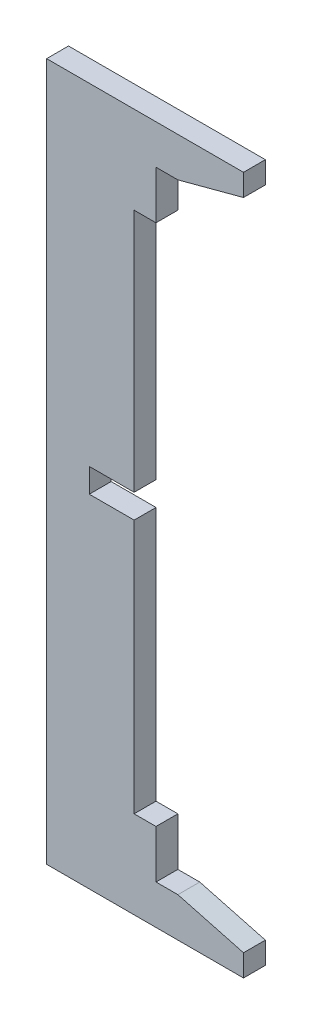
ISO-10303-21;
HEADER;
FILE_DESCRIPTION(('STEP AP214'),'2;1');
FILE_NAME('part.step','',(''),(''),'','','');
FILE_SCHEMA(('AUTOMOTIVE_DESIGN { 1 0 10303 214 1 1 1 1 }'));
ENDSEC;
DATA;
#1=APPLICATION_CONTEXT('core data for automotive mechanical design processes');
#2=APPLICATION_PROTOCOL_DEFINITION('international standard','automotive_design',2000,#1);
#3=PRODUCT_CONTEXT('',#1,'mechanical');
#4=PRODUCT('Part','Part','',(#3));
#5=PRODUCT_RELATED_PRODUCT_CATEGORY('part','',(#4));
#6=PRODUCT_DEFINITION_FORMATION('','',#4);
#7=PRODUCT_DEFINITION_CONTEXT('part definition',#1,'design');
#8=PRODUCT_DEFINITION('design','',#6,#7);
#9=PRODUCT_DEFINITION_SHAPE('','',#8);
#10=(LENGTH_UNIT() NAMED_UNIT(*) SI_UNIT(.MILLI.,.METRE.));
#11=(NAMED_UNIT(*) PLANE_ANGLE_UNIT() SI_UNIT($,.RADIAN.));
#12=(NAMED_UNIT(*) SI_UNIT($,.STERADIAN.) SOLID_ANGLE_UNIT());
#13=UNCERTAINTY_MEASURE_WITH_UNIT(LENGTH_MEASURE(1.E-05),#10,'distance_accuracy_value','');
#14=(GEOMETRIC_REPRESENTATION_CONTEXT(3) GLOBAL_UNCERTAINTY_ASSIGNED_CONTEXT((#13)) GLOBAL_UNIT_ASSIGNED_CONTEXT((#10,
#11,#12)) REPRESENTATION_CONTEXT('',''));
#15=CARTESIAN_POINT('',(0.,0.,0.));
#16=DIRECTION('',(0.,0.,1.));
#17=DIRECTION('',(1.,0.,0.));
#18=AXIS2_PLACEMENT_3D('',#15,#16,#17);
#19=CARTESIAN_POINT('',(-366.252975542008,-70.0794818591962,2.5));
#20=DIRECTION('',(-1.,0.,0.));
#21=DIRECTION('',(0.,0.,1.));
#22=AXIS2_PLACEMENT_3D('',#19,#20,#21);
#23=PLANE('',#22);
#24=DIRECTION('',(0.,1.,0.));
#25=VECTOR('',#24,1.);
#26=CARTESIAN_POINT('',(-366.252975542008,-70.0794818591962,-2.5));
#27=LINE('',#26,#25);
#28=CARTESIAN_POINT('',(-366.252975542008,-70.0794818591962,-2.5));
#29=VERTEX_POINT('',#28);
#30=CARTESIAN_POINT('',(-366.252975542008,-14.229117514226,-2.5));
#31=VERTEX_POINT('',#30);
#32=EDGE_CURVE('E188',#29,#31,#27,.T.);
#33=ORIENTED_EDGE('',*,*,#32,.T.);
#34=DIRECTION('',(0.,0.,-1.));
#35=VECTOR('',#34,1.);
#36=CARTESIAN_POINT('',(-366.252975542008,-14.229117514226,2.5));
#37=LINE('',#36,#35);
#38=CARTESIAN_POINT('',(-366.252975542008,-14.229117514226,2.5));
#39=VERTEX_POINT('',#38);
#40=EDGE_CURVE('E11',#39,#31,#37,.T.);
#41=ORIENTED_EDGE('',*,*,#40,.F.);
#42=DIRECTION('',(0.,1.,0.));
#43=VECTOR('',#42,1.);
#44=CARTESIAN_POINT('',(-366.252975542008,-70.0794818591962,2.5));
#45=LINE('',#44,#43);
#46=CARTESIAN_POINT('',(-366.252975542008,-70.0794818591962,2.5));
#47=VERTEX_POINT('',#46);
#48=EDGE_CURVE('E222',#47,#39,#45,.T.);
#49=ORIENTED_EDGE('',*,*,#48,.F.);
#50=DIRECTION('',(0.,0.,-1.));
#51=VECTOR('',#50,1.);
#52=CARTESIAN_POINT('',(-366.252975542008,-70.0794818591962,2.5));
#53=LINE('',#52,#51);
#54=EDGE_CURVE('E184',#47,#29,#53,.T.);
#55=ORIENTED_EDGE('',*,*,#54,.T.);
#56=EDGE_LOOP('',(#33,#41,#49,#55));
#57=FACE_BOUND('',#56,.T.);
#58=ADVANCED_FACE('F32',(#57),#23,.F.);
#59=CARTESIAN_POINT('',(-366.252975542008,-14.229117514226,2.5));
#60=DIRECTION('',(0.,1.,0.));
#61=DIRECTION('',(0.,0.,1.));
#62=AXIS2_PLACEMENT_3D('',#59,#60,#61);
#63=PLANE('',#62);
#64=DIRECTION('',(1.,0.,0.));
#65=VECTOR('',#64,1.);
#66=CARTESIAN_POINT('',(-366.252975542008,-14.229117514226,-2.5));
#67=LINE('',#66,#65);
#68=CARTESIAN_POINT('',(-361.252975542008,-14.229117514226,-2.5));
#69=VERTEX_POINT('',#68);
#70=EDGE_CURVE('E191',#31,#69,#67,.T.);
#71=ORIENTED_EDGE('',*,*,#70,.T.);
#72=DIRECTION('',(0.,0.,-1.));
#73=VECTOR('',#72,1.);
#74=CARTESIAN_POINT('',(-361.252975542008,-14.229117514226,2.5));
#75=LINE('',#74,#73);
#76=CARTESIAN_POINT('',(-361.252975542008,-14.229117514226,2.5));
#77=VERTEX_POINT('',#76);
#78=EDGE_CURVE('E40',#77,#69,#75,.T.);
#79=ORIENTED_EDGE('',*,*,#78,.F.);
#80=DIRECTION('',(1.,0.,0.));
#81=VECTOR('',#80,1.);
#82=CARTESIAN_POINT('',(-366.252975542008,-14.229117514226,2.5));
#83=LINE('',#82,#81);
#84=EDGE_CURVE('E121',#39,#77,#83,.T.);
#85=ORIENTED_EDGE('',*,*,#84,.F.);
#86=ORIENTED_EDGE('',*,*,#40,.T.);
#87=EDGE_LOOP('',(#71,#79,#85,#86));
#88=FACE_BOUND('',#87,.T.);
#89=ADVANCED_FACE('F330',(#88),#63,.F.);
#90=CARTESIAN_POINT('',(-361.252975542008,-14.229117514226,2.5));
#91=DIRECTION('',(-1.,0.,0.));
#92=DIRECTION('',(0.,0.,1.));
#93=AXIS2_PLACEMENT_3D('',#90,#91,#92);
#94=PLANE('',#93);
#95=DIRECTION('',(0.,1.,0.));
#96=VECTOR('',#95,1.);
#97=CARTESIAN_POINT('',(-361.252975542008,-14.229117514226,-2.5));
#98=LINE('',#97,#96);
#99=CARTESIAN_POINT('',(-361.252975542008,-3.22911751422602,-2.5));
#100=VERTEX_POINT('',#99);
#101=EDGE_CURVE('E193',#69,#100,#98,.T.);
#102=ORIENTED_EDGE('',*,*,#101,.T.);
#103=DIRECTION('',(0.,0.,-1.));
#104=VECTOR('',#103,1.);
#105=CARTESIAN_POINT('',(-361.252975542008,-3.22911751422602,2.5));
#106=LINE('',#105,#104);
#107=CARTESIAN_POINT('',(-361.252975542008,-3.22911751422602,2.5));
#108=VERTEX_POINT('',#107);
#109=EDGE_CURVE('E259',#108,#100,#106,.T.);
#110=ORIENTED_EDGE('',*,*,#109,.F.);
#111=DIRECTION('',(0.,1.,0.));
#112=VECTOR('',#111,1.);
#113=CARTESIAN_POINT('',(-361.252975542008,-14.229117514226,2.5));
#114=LINE('',#113,#112);
#115=EDGE_CURVE('E267',#77,#108,#114,.T.);
#116=ORIENTED_EDGE('',*,*,#115,.F.);
#117=ORIENTED_EDGE('',*,*,#78,.T.);
#118=EDGE_LOOP('',(#102,#110,#116,#117));
#119=FACE_BOUND('',#118,.T.);
#120=ADVANCED_FACE('F265',(#119),#94,.F.);
#121=CARTESIAN_POINT('',(-361.252975542008,-3.22911751422602,2.5));
#122=DIRECTION('',(0.,1.,0.));
#123=DIRECTION('',(0.,0.,1.));
#124=AXIS2_PLACEMENT_3D('',#121,#122,#123);
#125=PLANE('',#124);
#126=DIRECTION('',(1.,0.,0.));
#127=VECTOR('',#126,1.);
#128=CARTESIAN_POINT('',(-361.252975542008,-3.22911751422602,-2.5));
#129=LINE('',#128,#127);
#130=CARTESIAN_POINT('',(-356.252975542007,-3.22911751422602,-2.5));
#131=VERTEX_POINT('',#130);
#132=EDGE_CURVE('E195',#100,#131,#129,.T.);
#133=ORIENTED_EDGE('',*,*,#132,.T.);
#134=DIRECTION('',(0.,0.,-1.));
#135=VECTOR('',#134,1.);
#136=CARTESIAN_POINT('',(-356.252975542007,-3.22911751422602,2.5));
#137=LINE('',#136,#135);
#138=CARTESIAN_POINT('',(-356.252975542007,-3.22911751422602,2.5));
#139=VERTEX_POINT('',#138);
#140=EDGE_CURVE('E256',#139,#131,#137,.T.);
#141=ORIENTED_EDGE('',*,*,#140,.F.);
#142=DIRECTION('',(1.,0.,0.));
#143=VECTOR('',#142,1.);
#144=CARTESIAN_POINT('',(-361.252975542008,-3.22911751422602,2.5));
#145=LINE('',#144,#143);
#146=EDGE_CURVE('E285',#108,#139,#145,.T.);
#147=ORIENTED_EDGE('',*,*,#146,.F.);
#148=ORIENTED_EDGE('',*,*,#109,.T.);
#149=EDGE_LOOP('',(#133,#141,#147,#148));
#150=FACE_BOUND('',#149,.T.);
#151=ADVANCED_FACE('F276',(#150),#125,.F.);
#152=CARTESIAN_POINT('',(-356.252975542007,-3.22911751422602,2.5));
#153=DIRECTION('',(-0.257662650560351,0.966234939601241,0.));
#154=DIRECTION('',(-0.966234939601241,-0.257662650560351,0.));
#155=AXIS2_PLACEMENT_3D('',#152,#153,#154);
#156=PLANE('',#155);
#157=DIRECTION('',(0.966234939601241,0.257662650560351,0.));
#158=VECTOR('',#157,1.);
#159=CARTESIAN_POINT('',(-356.252975542007,-3.22911751422602,-2.5));
#160=LINE('',#159,#158);
#161=CARTESIAN_POINT('',(-341.252975542008,0.770882485774155,-2.5));
#162=VERTEX_POINT('',#161);
#163=EDGE_CURVE('E197',#131,#162,#160,.T.);
#164=ORIENTED_EDGE('',*,*,#163,.T.);
#165=DIRECTION('',(0.,0.,-1.));
#166=VECTOR('',#165,1.);
#167=CARTESIAN_POINT('',(-341.252975542008,0.770882485774155,2.5));
#168=LINE('',#167,#166);
#169=CARTESIAN_POINT('',(-341.252975542008,0.770882485774155,2.5));
#170=VERTEX_POINT('',#169);
#171=EDGE_CURVE('E253',#170,#162,#168,.T.);
#172=ORIENTED_EDGE('',*,*,#171,.F.);
#173=DIRECTION('',(0.966234939601241,0.257662650560351,0.));
#174=VECTOR('',#173,1.);
#175=CARTESIAN_POINT('',(-356.252975542007,-3.22911751422602,2.5));
#176=LINE('',#175,#174);
#177=EDGE_CURVE('E282',#139,#170,#176,.T.);
#178=ORIENTED_EDGE('',*,*,#177,.F.);
#179=ORIENTED_EDGE('',*,*,#140,.T.);
#180=EDGE_LOOP('',(#164,#172,#178,#179));
#181=FACE_BOUND('',#180,.T.);
#182=ADVANCED_FACE('F280',(#181),#156,.F.);
#183=CARTESIAN_POINT('',(-341.252975542008,0.770882485774155,2.5));
#184=DIRECTION('',(-1.,0.,0.));
#185=DIRECTION('',(0.,0.,1.));
#186=AXIS2_PLACEMENT_3D('',#183,#184,#185);
#187=PLANE('',#186);
#188=DIRECTION('',(0.,1.,0.));
#189=VECTOR('',#188,1.);
#190=CARTESIAN_POINT('',(-341.252975542008,0.770882485774155,-2.5));
#191=LINE('',#190,#189);
#192=CARTESIAN_POINT('',(-341.252975542008,5.7708824857741,-2.5));
#193=VERTEX_POINT('',#192);
#194=EDGE_CURVE('E199',#162,#193,#191,.T.);
#195=ORIENTED_EDGE('',*,*,#194,.T.);
#196=DIRECTION('',(0.,0.,-1.));
#197=VECTOR('',#196,1.);
#198=CARTESIAN_POINT('',(-341.252975542008,5.7708824857741,2.5));
#199=LINE('',#198,#197);
#200=CARTESIAN_POINT('',(-341.252975542008,5.7708824857741,2.5));
#201=VERTEX_POINT('',#200);
#202=EDGE_CURVE('E250',#201,#193,#199,.T.);
#203=ORIENTED_EDGE('',*,*,#202,.F.);
#204=DIRECTION('',(0.,1.,0.));
#205=VECTOR('',#204,1.);
#206=CARTESIAN_POINT('',(-341.252975542008,0.770882485774155,2.5));
#207=LINE('',#206,#205);
#208=EDGE_CURVE('E284',#170,#201,#207,.T.);
#209=ORIENTED_EDGE('',*,*,#208,.F.);
#210=ORIENTED_EDGE('',*,*,#171,.T.);
#211=EDGE_LOOP('',(#195,#203,#209,#210));
#212=FACE_BOUND('',#211,.T.);
#213=ADVANCED_FACE('F343',(#212),#187,.F.);
#214=CARTESIAN_POINT('',(-341.252975542008,5.7708824857741,2.5));
#215=DIRECTION('',(-1.92515756422842E-13,-1.,0.));
#216=DIRECTION('',(1.,-1.92515756422842E-13,0.));
#217=AXIS2_PLACEMENT_3D('',#214,#215,#216);
#218=PLANE('',#217);
#219=DIRECTION('',(-1.,1.92515756422842E-13,0.));
#220=VECTOR('',#219,1.);
#221=CARTESIAN_POINT('',(-341.252975542008,5.7708824857741,-2.5));
#222=LINE('',#221,#220);
#223=CARTESIAN_POINT('',(-386.252975542009,5.77088248578276,-2.5));
#224=VERTEX_POINT('',#223);
#225=EDGE_CURVE('E201',#193,#224,#222,.T.);
#226=ORIENTED_EDGE('',*,*,#225,.T.);
#227=DIRECTION('',(0.,0.,-1.));
#228=VECTOR('',#227,1.);
#229=CARTESIAN_POINT('',(-386.252975542009,5.77088248578276,2.5));
#230=LINE('',#229,#228);
#231=CARTESIAN_POINT('',(-386.252975542009,5.77088248578276,2.5));
#232=VERTEX_POINT('',#231);
#233=EDGE_CURVE('E247',#232,#224,#230,.T.);
#234=ORIENTED_EDGE('',*,*,#233,.F.);
#235=DIRECTION('',(-1.,1.92515756422842E-13,0.));
#236=VECTOR('',#235,1.);
#237=CARTESIAN_POINT('',(-341.252975542008,5.7708824857741,2.5));
#238=LINE('',#237,#236);
#239=EDGE_CURVE('E287',#201,#232,#238,.T.);
#240=ORIENTED_EDGE('',*,*,#239,.F.);
#241=ORIENTED_EDGE('',*,*,#202,.T.);
#242=EDGE_LOOP('',(#226,#234,#240,#241));
#243=FACE_BOUND('',#242,.T.);
#244=ADVANCED_FACE('F346',(#243),#218,.F.);
#245=CARTESIAN_POINT('',(-386.252975542009,-153.729086598938,2.5));
#246=DIRECTION('',(1.,0.,0.));
#247=DIRECTION('',(0.,0.,-1.));
#248=AXIS2_PLACEMENT_3D('',#245,#246,#247);
#249=PLANE('',#248);
#250=DIRECTION('',(0.,-1.,0.));
#251=VECTOR('',#250,1.);
#252=CARTESIAN_POINT('',(-386.252975542009,-153.729086598938,-2.5));
#253=LINE('',#252,#251);
#254=CARTESIAN_POINT('',(-386.252975542009,-153.729086598938,-2.5));
#255=VERTEX_POINT('',#254);
#256=EDGE_CURVE('E203',#224,#255,#253,.T.);
#257=ORIENTED_EDGE('',*,*,#256,.T.);
#258=DIRECTION('',(0.,0.,-1.));
#259=VECTOR('',#258,1.);
#260=CARTESIAN_POINT('',(-386.252975542009,-153.729086598938,2.5));
#261=LINE('',#260,#259);
#262=CARTESIAN_POINT('',(-386.252975542009,-153.729086598938,2.5));
#263=VERTEX_POINT('',#262);
#264=EDGE_CURVE('E244',#263,#255,#261,.T.);
#265=ORIENTED_EDGE('',*,*,#264,.F.);
#266=DIRECTION('',(0.,-1.,0.));
#267=VECTOR('',#266,1.);
#268=CARTESIAN_POINT('',(-386.252975542009,-153.729086598938,2.5));
#269=LINE('',#268,#267);
#270=EDGE_CURVE('E293',#232,#263,#269,.T.);
#271=ORIENTED_EDGE('',*,*,#270,.F.);
#272=ORIENTED_EDGE('',*,*,#233,.T.);
#273=EDGE_LOOP('',(#257,#265,#271,#272));
#274=FACE_BOUND('',#273,.T.);
#275=ADVANCED_FACE('F350',(#274),#249,.F.);
#276=CARTESIAN_POINT('',(-341.252975542008,-153.729086598929,2.5));
#277=DIRECTION('',(-1.93055448170924E-13,1.,0.));
#278=DIRECTION('',(-1.,-1.93055448170924E-13,0.));
#279=AXIS2_PLACEMENT_3D('',#276,#277,#278);
#280=PLANE('',#279);
#281=DIRECTION('',(1.,1.93055448170924E-13,0.));
#282=VECTOR('',#281,1.);
#283=CARTESIAN_POINT('',(-341.252975542008,-153.729086598929,-2.5));
#284=LINE('',#283,#282);
#285=CARTESIAN_POINT('',(-341.252975542008,-153.729086598929,-2.5));
#286=VERTEX_POINT('',#285);
#287=EDGE_CURVE('E205',#255,#286,#284,.T.);
#288=ORIENTED_EDGE('',*,*,#287,.T.);
#289=DIRECTION('',(0.,0.,-1.));
#290=VECTOR('',#289,1.);
#291=CARTESIAN_POINT('',(-341.252975542008,-153.729086598929,2.5));
#292=LINE('',#291,#290);
#293=CARTESIAN_POINT('',(-341.252975542008,-153.729086598929,2.5));
#294=VERTEX_POINT('',#293);
#295=EDGE_CURVE('E241',#294,#286,#292,.T.);
#296=ORIENTED_EDGE('',*,*,#295,.F.);
#297=DIRECTION('',(1.,1.93055448170924E-13,0.));
#298=VECTOR('',#297,1.);
#299=CARTESIAN_POINT('',(-341.252975542008,-153.729086598929,2.5));
#300=LINE('',#299,#298);
#301=EDGE_CURVE('E295',#263,#294,#300,.T.);
#302=ORIENTED_EDGE('',*,*,#301,.F.);
#303=ORIENTED_EDGE('',*,*,#264,.T.);
#304=EDGE_LOOP('',(#288,#296,#302,#303));
#305=FACE_BOUND('',#304,.T.);
#306=ADVANCED_FACE('F354',(#305),#280,.F.);
#307=CARTESIAN_POINT('',(-341.252975542008,-148.729086598929,2.5));
#308=DIRECTION('',(-1.,0.,0.));
#309=DIRECTION('',(0.,0.,1.));
#310=AXIS2_PLACEMENT_3D('',#307,#308,#309);
#311=PLANE('',#310);
#312=DIRECTION('',(0.,1.,0.));
#313=VECTOR('',#312,1.);
#314=CARTESIAN_POINT('',(-341.252975542008,-148.729086598929,-2.5));
#315=LINE('',#314,#313);
#316=CARTESIAN_POINT('',(-341.252975542008,-148.729086598929,-2.5));
#317=VERTEX_POINT('',#316);
#318=EDGE_CURVE('E207',#286,#317,#315,.T.);
#319=ORIENTED_EDGE('',*,*,#318,.T.);
#320=DIRECTION('',(0.,0.,-1.));
#321=VECTOR('',#320,1.);
#322=CARTESIAN_POINT('',(-341.252975542008,-148.729086598929,2.5));
#323=LINE('',#322,#321);
#324=CARTESIAN_POINT('',(-341.252975542008,-148.729086598929,2.5));
#325=VERTEX_POINT('',#324);
#326=EDGE_CURVE('E238',#325,#317,#323,.T.);
#327=ORIENTED_EDGE('',*,*,#326,.F.);
#328=DIRECTION('',(0.,1.,0.));
#329=VECTOR('',#328,1.);
#330=CARTESIAN_POINT('',(-341.252975542008,-148.729086598929,2.5));
#331=LINE('',#330,#329);
#332=EDGE_CURVE('E297',#294,#325,#331,.T.);
#333=ORIENTED_EDGE('',*,*,#332,.F.);
#334=ORIENTED_EDGE('',*,*,#295,.T.);
#335=EDGE_LOOP('',(#319,#327,#333,#334));
#336=FACE_BOUND('',#335,.T.);
#337=ADVANCED_FACE('F358',(#336),#311,.F.);
#338=CARTESIAN_POINT('',(-356.252975542007,-144.729086598929,2.5));
#339=DIRECTION('',(-0.257662650560339,-0.966234939601245,0.));
#340=DIRECTION('',(0.966234939601245,-0.257662650560339,0.));
#341=AXIS2_PLACEMENT_3D('',#338,#339,#340);
#342=PLANE('',#341);
#343=DIRECTION('',(-0.966234939601245,0.257662650560339,0.));
#344=VECTOR('',#343,1.);
#345=CARTESIAN_POINT('',(-356.252975542007,-144.729086598929,-2.5));
#346=LINE('',#345,#344);
#347=CARTESIAN_POINT('',(-356.252975542007,-144.729086598929,-2.5));
#348=VERTEX_POINT('',#347);
#349=EDGE_CURVE('E209',#317,#348,#346,.T.);
#350=ORIENTED_EDGE('',*,*,#349,.T.);
#351=DIRECTION('',(0.,0.,-1.));
#352=VECTOR('',#351,1.);
#353=CARTESIAN_POINT('',(-356.252975542007,-144.729086598929,2.5));
#354=LINE('',#353,#352);
#355=CARTESIAN_POINT('',(-356.252975542007,-144.729086598929,2.5));
#356=VERTEX_POINT('',#355);
#357=EDGE_CURVE('E235',#356,#348,#354,.T.);
#358=ORIENTED_EDGE('',*,*,#357,.F.);
#359=DIRECTION('',(-0.966234939601245,0.257662650560339,0.));
#360=VECTOR('',#359,1.);
#361=CARTESIAN_POINT('',(-356.252975542007,-144.729086598929,2.5));
#362=LINE('',#361,#360);
#363=EDGE_CURVE('E299',#325,#356,#362,.T.);
#364=ORIENTED_EDGE('',*,*,#363,.F.);
#365=ORIENTED_EDGE('',*,*,#326,.T.);
#366=EDGE_LOOP('',(#350,#358,#364,#365));
#367=FACE_BOUND('',#366,.T.);
#368=ADVANCED_FACE('F362',(#367),#342,.F.);
#369=CARTESIAN_POINT('',(-361.252975542008,-144.729086598929,2.5));
#370=DIRECTION('',(0.,-1.,0.));
#371=DIRECTION('',(0.,0.,-1.));
#372=AXIS2_PLACEMENT_3D('',#369,#370,#371);
#373=PLANE('',#372);
#374=DIRECTION('',(-1.,0.,0.));
#375=VECTOR('',#374,1.);
#376=CARTESIAN_POINT('',(-361.252975542008,-144.729086598929,-2.5));
#377=LINE('',#376,#375);
#378=CARTESIAN_POINT('',(-361.252975542008,-144.729086598929,-2.5));
#379=VERTEX_POINT('',#378);
#380=EDGE_CURVE('E211',#348,#379,#377,.T.);
#381=ORIENTED_EDGE('',*,*,#380,.T.);
#382=DIRECTION('',(0.,0.,-1.));
#383=VECTOR('',#382,1.);
#384=CARTESIAN_POINT('',(-361.252975542008,-144.729086598929,2.5));
#385=LINE('',#384,#383);
#386=CARTESIAN_POINT('',(-361.252975542008,-144.729086598929,2.5));
#387=VERTEX_POINT('',#386);
#388=EDGE_CURVE('E232',#387,#379,#385,.T.);
#389=ORIENTED_EDGE('',*,*,#388,.F.);
#390=DIRECTION('',(-1.,0.,0.));
#391=VECTOR('',#390,1.);
#392=CARTESIAN_POINT('',(-361.252975542008,-144.729086598929,2.5));
#393=LINE('',#392,#391);
#394=EDGE_CURVE('E301',#356,#387,#393,.T.);
#395=ORIENTED_EDGE('',*,*,#394,.F.);
#396=ORIENTED_EDGE('',*,*,#357,.T.);
#397=EDGE_LOOP('',(#381,#389,#395,#396));
#398=FACE_BOUND('',#397,.T.);
#399=ADVANCED_FACE('F366',(#398),#373,.F.);
#400=CARTESIAN_POINT('',(-361.252975542008,-133.729086598929,2.5));
#401=DIRECTION('',(-1.,0.,0.));
#402=DIRECTION('',(0.,0.,1.));
#403=AXIS2_PLACEMENT_3D('',#400,#401,#402);
#404=PLANE('',#403);
#405=DIRECTION('',(0.,1.,0.));
#406=VECTOR('',#405,1.);
#407=CARTESIAN_POINT('',(-361.252975542008,-133.729086598929,-2.5));
#408=LINE('',#407,#406);
#409=CARTESIAN_POINT('',(-361.252975542008,-133.729086598929,-2.5));
#410=VERTEX_POINT('',#409);
#411=EDGE_CURVE('E213',#379,#410,#408,.T.);
#412=ORIENTED_EDGE('',*,*,#411,.T.);
#413=DIRECTION('',(0.,0.,-1.));
#414=VECTOR('',#413,1.);
#415=CARTESIAN_POINT('',(-361.252975542008,-133.729086598929,2.5));
#416=LINE('',#415,#414);
#417=CARTESIAN_POINT('',(-361.252975542008,-133.729086598929,2.5));
#418=VERTEX_POINT('',#417);
#419=EDGE_CURVE('E229',#418,#410,#416,.T.);
#420=ORIENTED_EDGE('',*,*,#419,.F.);
#421=DIRECTION('',(0.,1.,0.));
#422=VECTOR('',#421,1.);
#423=CARTESIAN_POINT('',(-361.252975542008,-133.729086598929,2.5));
#424=LINE('',#423,#422);
#425=EDGE_CURVE('E303',#387,#418,#424,.T.);
#426=ORIENTED_EDGE('',*,*,#425,.F.);
#427=ORIENTED_EDGE('',*,*,#388,.T.);
#428=EDGE_LOOP('',(#412,#420,#426,#427));
#429=FACE_BOUND('',#428,.T.);
#430=ADVANCED_FACE('F370',(#429),#404,.F.);
#431=CARTESIAN_POINT('',(-366.252975542008,-133.729086598929,2.5));
#432=DIRECTION('',(0.,-1.,0.));
#433=DIRECTION('',(0.,0.,-1.));
#434=AXIS2_PLACEMENT_3D('',#431,#432,#433);
#435=PLANE('',#434);
#436=DIRECTION('',(-1.,0.,0.));
#437=VECTOR('',#436,1.);
#438=CARTESIAN_POINT('',(-366.252975542008,-133.729086598929,-2.5));
#439=LINE('',#438,#437);
#440=CARTESIAN_POINT('',(-366.252975542008,-133.729086598929,-2.5));
#441=VERTEX_POINT('',#440);
#442=EDGE_CURVE('E215',#410,#441,#439,.T.);
#443=ORIENTED_EDGE('',*,*,#442,.T.);
#444=DIRECTION('',(0.,0.,-1.));
#445=VECTOR('',#444,1.);
#446=CARTESIAN_POINT('',(-366.252975542008,-133.729086598929,2.5));
#447=LINE('',#446,#445);
#448=CARTESIAN_POINT('',(-366.252975542008,-133.729086598929,2.5));
#449=VERTEX_POINT('',#448);
#450=EDGE_CURVE('E226',#449,#441,#447,.T.);
#451=ORIENTED_EDGE('',*,*,#450,.F.);
#452=DIRECTION('',(-1.,0.,0.));
#453=VECTOR('',#452,1.);
#454=CARTESIAN_POINT('',(-366.252975542008,-133.729086598929,2.5));
#455=LINE('',#454,#453);
#456=EDGE_CURVE('E305',#418,#449,#455,.T.);
#457=ORIENTED_EDGE('',*,*,#456,.F.);
#458=ORIENTED_EDGE('',*,*,#419,.T.);
#459=EDGE_LOOP('',(#443,#451,#457,#458));
#460=FACE_BOUND('',#459,.T.);
#461=ADVANCED_FACE('F311',(#460),#435,.F.);
#462=CARTESIAN_POINT('',(-366.252975542008,-133.729086598929,2.5));
#463=DIRECTION('',(-1.,0.,0.));
#464=DIRECTION('',(0.,-1.,0.));
#465=AXIS2_PLACEMENT_3D('',#462,#463,#464);
#466=PLANE('',#465);
#467=DIRECTION('',(0.,1.,0.));
#468=VECTOR('',#467,1.);
#469=CARTESIAN_POINT('',(-366.252975542008,-133.729086598929,-2.5));
#470=LINE('',#469,#468);
#471=CARTESIAN_POINT('',(-366.252975542009,-75.5794818591971,-2.5));
#472=VERTEX_POINT('',#471);
#473=EDGE_CURVE('E217',#441,#472,#470,.T.);
#474=ORIENTED_EDGE('',*,*,#473,.T.);
#475=DIRECTION('',(0.,0.,-1.));
#476=VECTOR('',#475,1.);
#477=CARTESIAN_POINT('',(-366.252975542009,-75.5794818591971,2.5));
#478=LINE('',#477,#476);
#479=CARTESIAN_POINT('',(-366.252975542009,-75.5794818591971,2.5));
#480=VERTEX_POINT('',#479);
#481=EDGE_CURVE('E179',#480,#472,#478,.T.);
#482=ORIENTED_EDGE('',*,*,#481,.F.);
#483=DIRECTION('',(0.,1.,0.));
#484=VECTOR('',#483,1.);
#485=CARTESIAN_POINT('',(-366.252975542008,-133.729086598929,2.5));
#486=LINE('',#485,#484);
#487=EDGE_CURVE('E170',#449,#480,#486,.T.);
#488=ORIENTED_EDGE('',*,*,#487,.F.);
#489=ORIENTED_EDGE('',*,*,#450,.T.);
#490=EDGE_LOOP('',(#474,#482,#488,#489));
#491=FACE_BOUND('',#490,.T.);
#492=ADVANCED_FACE('F315',(#491),#466,.F.);
#493=CARTESIAN_POINT('',(-376.502975542008,-75.5794818591971,2.5));
#494=DIRECTION('',(0.,-1.,0.));
#495=DIRECTION('',(0.,0.,-1.));
#496=AXIS2_PLACEMENT_3D('',#493,#494,#495);
#497=PLANE('',#496);
#498=DIRECTION('',(-1.,0.,0.));
#499=VECTOR('',#498,1.);
#500=CARTESIAN_POINT('',(-376.502975542008,-75.5794818591971,-2.5));
#501=LINE('',#500,#499);
#502=CARTESIAN_POINT('',(-376.502975542008,-75.5794818591971,-2.5));
#503=VERTEX_POINT('',#502);
#504=EDGE_CURVE('E178',#472,#503,#501,.T.);
#505=ORIENTED_EDGE('',*,*,#504,.T.);
#506=DIRECTION('',(0.,0.,-1.));
#507=VECTOR('',#506,1.);
#508=CARTESIAN_POINT('',(-376.502975542008,-75.5794818591971,2.5));
#509=LINE('',#508,#507);
#510=CARTESIAN_POINT('',(-376.502975542008,-75.5794818591971,2.5));
#511=VERTEX_POINT('',#510);
#512=EDGE_CURVE('E175',#511,#503,#509,.T.);
#513=ORIENTED_EDGE('',*,*,#512,.F.);
#514=DIRECTION('',(-1.,0.,0.));
#515=VECTOR('',#514,1.);
#516=CARTESIAN_POINT('',(-376.502975542008,-75.5794818591971,2.5));
#517=LINE('',#516,#515);
#518=EDGE_CURVE('E164',#480,#511,#517,.T.);
#519=ORIENTED_EDGE('',*,*,#518,.F.);
#520=ORIENTED_EDGE('',*,*,#481,.T.);
#521=EDGE_LOOP('',(#505,#513,#519,#520));
#522=FACE_BOUND('',#521,.T.);
#523=ADVANCED_FACE('F176',(#522),#497,.F.);
#524=CARTESIAN_POINT('',(-376.502975542008,-70.0794818591962,2.5));
#525=DIRECTION('',(-1.,0.,0.));
#526=DIRECTION('',(0.,0.,1.));
#527=AXIS2_PLACEMENT_3D('',#524,#525,#526);
#528=PLANE('',#527);
#529=DIRECTION('',(0.,1.,0.));
#530=VECTOR('',#529,1.);
#531=CARTESIAN_POINT('',(-376.502975542008,-70.0794818591962,-2.5));
#532=LINE('',#531,#530);
#533=CARTESIAN_POINT('',(-376.502975542008,-70.0794818591962,-2.5));
#534=VERTEX_POINT('',#533);
#535=EDGE_CURVE('E107',#503,#534,#532,.T.);
#536=ORIENTED_EDGE('',*,*,#535,.T.);
#537=DIRECTION('',(0.,0.,-1.));
#538=VECTOR('',#537,1.);
#539=CARTESIAN_POINT('',(-376.502975542008,-70.0794818591962,2.5));
#540=LINE('',#539,#538);
#541=CARTESIAN_POINT('',(-376.502975542008,-70.0794818591962,2.5));
#542=VERTEX_POINT('',#541);
#543=EDGE_CURVE('E180',#542,#534,#540,.T.);
#544=ORIENTED_EDGE('',*,*,#543,.F.);
#545=DIRECTION('',(0.,1.,0.));
#546=VECTOR('',#545,1.);
#547=CARTESIAN_POINT('',(-376.502975542008,-70.0794818591962,2.5));
#548=LINE('',#547,#546);
#549=EDGE_CURVE('E168',#511,#542,#548,.T.);
#550=ORIENTED_EDGE('',*,*,#549,.F.);
#551=ORIENTED_EDGE('',*,*,#512,.T.);
#552=EDGE_LOOP('',(#536,#544,#550,#551));
#553=FACE_BOUND('',#552,.T.);
#554=ADVANCED_FACE('F182',(#553),#528,.F.);
#555=CARTESIAN_POINT('',(-366.252975542008,-70.0794818591962,2.5));
#556=DIRECTION('',(0.,1.,0.));
#557=DIRECTION('',(0.,0.,1.));
#558=AXIS2_PLACEMENT_3D('',#555,#556,#557);
#559=PLANE('',#558);
#560=DIRECTION('',(1.,0.,0.));
#561=VECTOR('',#560,1.);
#562=CARTESIAN_POINT('',(-366.252975542008,-70.0794818591962,-2.5));
#563=LINE('',#562,#561);
#564=EDGE_CURVE('E113',#534,#29,#563,.T.);
#565=ORIENTED_EDGE('',*,*,#564,.T.);
#566=ORIENTED_EDGE('',*,*,#54,.F.);
#567=DIRECTION('',(1.,0.,0.));
#568=VECTOR('',#567,1.);
#569=CARTESIAN_POINT('',(-366.252975542008,-70.0794818591962,2.5));
#570=LINE('',#569,#568);
#571=EDGE_CURVE('E48',#542,#47,#570,.T.);
#572=ORIENTED_EDGE('',*,*,#571,.F.);
#573=ORIENTED_EDGE('',*,*,#543,.T.);
#574=EDGE_LOOP('',(#565,#566,#572,#573));
#575=FACE_BOUND('',#574,.T.);
#576=ADVANCED_FACE('F319',(#575),#559,.F.);
#577=CARTESIAN_POINT('',(0.,0.,2.5));
#578=DIRECTION('',(0.,0.,-1.));
#579=DIRECTION('',(-1.,0.,0.));
#580=AXIS2_PLACEMENT_3D('',#577,#578,#579);
#581=PLANE('',#580);
#582=ORIENTED_EDGE('',*,*,#48,.T.);
#583=ORIENTED_EDGE('',*,*,#84,.T.);
#584=ORIENTED_EDGE('',*,*,#115,.T.);
#585=ORIENTED_EDGE('',*,*,#146,.T.);
#586=ORIENTED_EDGE('',*,*,#177,.T.);
#587=ORIENTED_EDGE('',*,*,#208,.T.);
#588=ORIENTED_EDGE('',*,*,#239,.T.);
#589=ORIENTED_EDGE('',*,*,#270,.T.);
#590=ORIENTED_EDGE('',*,*,#301,.T.);
#591=ORIENTED_EDGE('',*,*,#332,.T.);
#592=ORIENTED_EDGE('',*,*,#363,.T.);
#593=ORIENTED_EDGE('',*,*,#394,.T.);
#594=ORIENTED_EDGE('',*,*,#425,.T.);
#595=ORIENTED_EDGE('',*,*,#456,.T.);
#596=ORIENTED_EDGE('',*,*,#487,.T.);
#597=ORIENTED_EDGE('',*,*,#518,.T.);
#598=ORIENTED_EDGE('',*,*,#549,.T.);
#599=ORIENTED_EDGE('',*,*,#571,.T.);
#600=EDGE_LOOP('',(#582,#583,#584,#585,#586,#587,#588,#589,#590,#591,#592,#593,#594,#595,#596,
#597,#598,#599));
#601=FACE_BOUND('',#600,.T.);
#602=ADVANCED_FACE('F166',(#601),#581,.F.);
#603=CARTESIAN_POINT('',(0.,0.,-2.5));
#604=DIRECTION('',(0.,0.,-1.));
#605=DIRECTION('',(-1.,0.,0.));
#606=AXIS2_PLACEMENT_3D('',#603,#604,#605);
#607=PLANE('',#606);
#608=ORIENTED_EDGE('',*,*,#32,.F.);
#609=ORIENTED_EDGE('',*,*,#564,.F.);
#610=ORIENTED_EDGE('',*,*,#535,.F.);
#611=ORIENTED_EDGE('',*,*,#504,.F.);
#612=ORIENTED_EDGE('',*,*,#473,.F.);
#613=ORIENTED_EDGE('',*,*,#442,.F.);
#614=ORIENTED_EDGE('',*,*,#411,.F.);
#615=ORIENTED_EDGE('',*,*,#380,.F.);
#616=ORIENTED_EDGE('',*,*,#349,.F.);
#617=ORIENTED_EDGE('',*,*,#318,.F.);
#618=ORIENTED_EDGE('',*,*,#287,.F.);
#619=ORIENTED_EDGE('',*,*,#256,.F.);
#620=ORIENTED_EDGE('',*,*,#225,.F.);
#621=ORIENTED_EDGE('',*,*,#194,.F.);
#622=ORIENTED_EDGE('',*,*,#163,.F.);
#623=ORIENTED_EDGE('',*,*,#132,.F.);
#624=ORIENTED_EDGE('',*,*,#101,.F.);
#625=ORIENTED_EDGE('',*,*,#70,.F.);
#626=EDGE_LOOP('',(#608,#609,#610,#611,#612,#613,#614,#615,#616,#617,#618,#619,#620,#621,#622,
#623,#624,#625));
#627=FACE_BOUND('',#626,.T.);
#628=ADVANCED_FACE('F271',(#627),#607,.T.);
#629=CLOSED_SHELL('',(#58,#89,#120,#151,#182,#213,#244,#275,#306,#337,#368,#399,#430,#461,#492,
#523,#554,#576,#602,#628));
#630=MANIFOLD_SOLID_BREP('B2',#629);
#631=ADVANCED_BREP_SHAPE_REPRESENTATION('',(#18,#630),#14);
#632=SHAPE_DEFINITION_REPRESENTATION(#9,#631);
ENDSEC;
END-ISO-10303-21;
